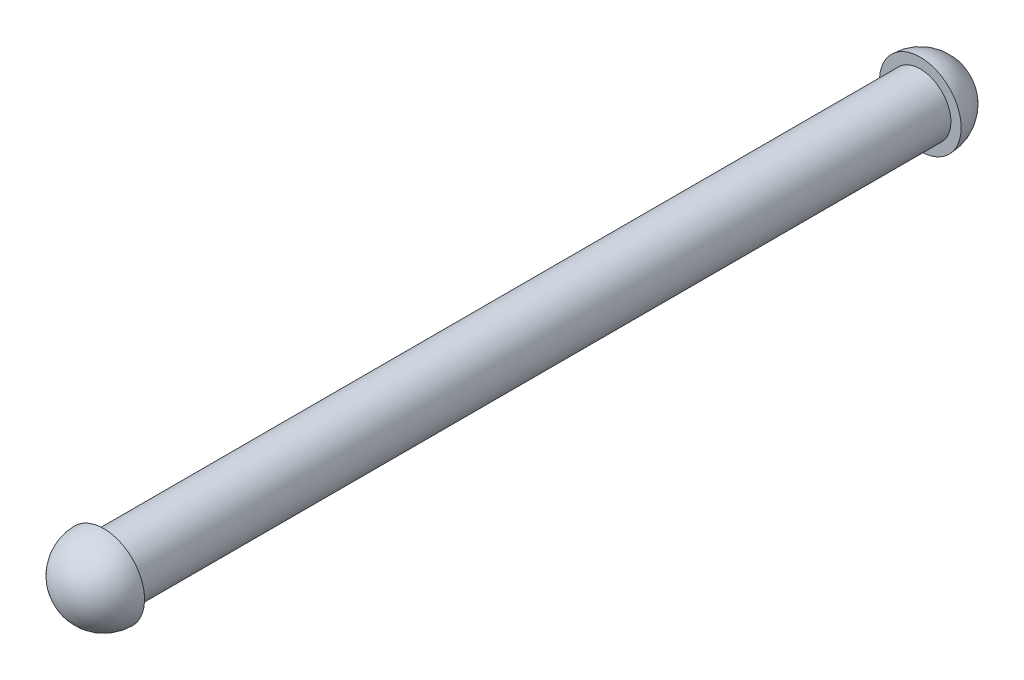
ISO-10303-21;
HEADER;
FILE_DESCRIPTION(('STEP AP214'),'2;1');
FILE_NAME('part.step','',(''),(''),'','','');
FILE_SCHEMA(('AUTOMOTIVE_DESIGN { 1 0 10303 214 1 1 1 1 }'));
ENDSEC;
DATA;
#1=APPLICATION_CONTEXT('core data for automotive mechanical design processes');
#2=APPLICATION_PROTOCOL_DEFINITION('international standard','automotive_design',2000,#1);
#3=PRODUCT_CONTEXT('',#1,'mechanical');
#4=PRODUCT('Part','Part','',(#3));
#5=PRODUCT_RELATED_PRODUCT_CATEGORY('part','',(#4));
#6=PRODUCT_DEFINITION_FORMATION('','',#4);
#7=PRODUCT_DEFINITION_CONTEXT('part definition',#1,'design');
#8=PRODUCT_DEFINITION('design','',#6,#7);
#9=PRODUCT_DEFINITION_SHAPE('','',#8);
#10=(LENGTH_UNIT() NAMED_UNIT(*) SI_UNIT(.MILLI.,.METRE.));
#11=(NAMED_UNIT(*) PLANE_ANGLE_UNIT() SI_UNIT($,.RADIAN.));
#12=(NAMED_UNIT(*) SI_UNIT($,.STERADIAN.) SOLID_ANGLE_UNIT());
#13=UNCERTAINTY_MEASURE_WITH_UNIT(LENGTH_MEASURE(1.E-05),#10,'distance_accuracy_value','');
#14=(GEOMETRIC_REPRESENTATION_CONTEXT(3) GLOBAL_UNCERTAINTY_ASSIGNED_CONTEXT((#13)) GLOBAL_UNIT_ASSIGNED_CONTEXT((#10,
#11,#12)) REPRESENTATION_CONTEXT('',''));
#15=CARTESIAN_POINT('',(0.,0.,0.));
#16=DIRECTION('',(0.,0.,1.));
#17=DIRECTION('',(1.,0.,0.));
#18=AXIS2_PLACEMENT_3D('',#15,#16,#17);
#19=CARTESIAN_POINT('',(0.,0.,0.));
#20=DIRECTION('',(-1.,0.,0.));
#21=DIRECTION('',(0.,-1.,0.));
#22=AXIS2_PLACEMENT_3D('',#19,#20,#21);
#23=SPHERICAL_SURFACE('',#22,0.5);
#24=CARTESIAN_POINT('',(0.,0.,0.));
#25=DIRECTION('',(0.,0.,-1.));
#26=DIRECTION('',(1.,0.,0.));
#27=AXIS2_PLACEMENT_3D('',#24,#25,#26);
#28=SPHERICAL_SURFACE('',#27,0.5);
#29=CARTESIAN_POINT('',(0.,0.,0.));
#30=DIRECTION('',(0.,0.,-1.));
#31=DIRECTION('',(1.,0.,0.));
#32=AXIS2_PLACEMENT_3D('',#29,#30,#31);
#33=CIRCLE('',#32,0.5);
#34=CARTESIAN_POINT('',(0.5,0.,0.));
#35=VERTEX_POINT('',#34);
#36=EDGE_CURVE('E39',#35,#35,#33,.T.);
#37=ORIENTED_EDGE('',*,*,#36,.T.);
#38=EDGE_LOOP('',(#37));
#39=FACE_BOUND('',#38,.T.);
#40=ADVANCED_FACE('F33',(#39),#28,.T.);
#41=CARTESIAN_POINT('',(0.,0.,0.));
#42=DIRECTION('',(0.,0.,-1.));
#43=DIRECTION('',(1.,0.,0.));
#44=AXIS2_PLACEMENT_3D('',#41,#42,#43);
#45=PLANE('',#44);
#46=CARTESIAN_POINT('',(0.,0.,0.));
#47=DIRECTION('',(0.,0.,-1.));
#48=DIRECTION('',(0.,1.,0.));
#49=AXIS2_PLACEMENT_3D('',#46,#47,#48);
#50=CIRCLE('',#49,0.375);
#51=CARTESIAN_POINT('',(0.,0.375,0.));
#52=VERTEX_POINT('',#51);
#53=EDGE_CURVE('E10',#52,#52,#50,.F.);
#54=ORIENTED_EDGE('',*,*,#53,.F.);
#55=EDGE_LOOP('',(#54));
#56=FACE_BOUND('',#55,.T.);
#57=ORIENTED_EDGE('',*,*,#36,.F.);
#58=EDGE_LOOP('',(#57));
#59=FACE_BOUND('',#58,.T.);
#60=ADVANCED_FACE('F65',(#56,#59),#45,.F.);
#61=CARTESIAN_POINT('',(0.,0.,10.));
#62=DIRECTION('',(0.,0.,-1.));
#63=DIRECTION('',(-1.,0.,0.));
#64=AXIS2_PLACEMENT_3D('',#61,#62,#63);
#65=CYLINDRICAL_SURFACE('',#64,0.375);
#66=CARTESIAN_POINT('',(0.,0.,10.));
#67=DIRECTION('',(0.,0.,1.));
#68=DIRECTION('',(1.,0.,0.));
#69=AXIS2_PLACEMENT_3D('',#66,#67,#68);
#70=CIRCLE('',#69,0.375);
#71=CARTESIAN_POINT('',(0.375,0.,10.));
#72=VERTEX_POINT('',#71);
#73=EDGE_CURVE('E43',#72,#72,#70,.T.);
#74=ORIENTED_EDGE('',*,*,#73,.F.);
#75=EDGE_LOOP('',(#74));
#76=FACE_BOUND('',#75,.T.);
#77=ORIENTED_EDGE('',*,*,#53,.T.);
#78=EDGE_LOOP('',(#77));
#79=FACE_BOUND('',#78,.T.);
#80=ADVANCED_FACE('F57',(#76,#79),#65,.T.);
#81=CARTESIAN_POINT('',(0.,0.,10.));
#82=DIRECTION('',(0.,-1.,0.));
#83=DIRECTION('',(1.,0.,0.));
#84=AXIS2_PLACEMENT_3D('',#81,#82,#83);
#85=SPHERICAL_SURFACE('',#84,0.5);
#86=CARTESIAN_POINT('',(0.,0.,10.));
#87=DIRECTION('',(0.,0.,-1.));
#88=DIRECTION('',(-1.,0.,0.));
#89=AXIS2_PLACEMENT_3D('',#86,#87,#88);
#90=SPHERICAL_SURFACE('',#89,0.5);
#91=CARTESIAN_POINT('',(0.,0.,10.));
#92=DIRECTION('',(0.,0.,-1.));
#93=DIRECTION('',(-1.,0.,0.));
#94=AXIS2_PLACEMENT_3D('',#91,#92,#93);
#95=CIRCLE('',#94,0.5);
#96=CARTESIAN_POINT('',(-0.5,0.,10.));
#97=VERTEX_POINT('',#96);
#98=EDGE_CURVE('E47',#97,#97,#95,.T.);
#99=ORIENTED_EDGE('',*,*,#98,.F.);
#100=EDGE_LOOP('',(#99));
#101=FACE_BOUND('',#100,.T.);
#102=ADVANCED_FACE('F55',(#101),#90,.T.);
#103=CARTESIAN_POINT('',(0.,0.,10.));
#104=DIRECTION('',(0.,0.,-1.));
#105=DIRECTION('',(-1.,0.,0.));
#106=AXIS2_PLACEMENT_3D('',#103,#104,#105);
#107=PLANE('',#106);
#108=ORIENTED_EDGE('',*,*,#73,.T.);
#109=EDGE_LOOP('',(#108));
#110=FACE_BOUND('',#109,.T.);
#111=ORIENTED_EDGE('',*,*,#98,.T.);
#112=EDGE_LOOP('',(#111));
#113=FACE_BOUND('',#112,.T.);
#114=ADVANCED_FACE('F53',(#110,#113),#107,.T.);
#115=CLOSED_SHELL('',(#40,#60,#80,#102,#114));
#116=MANIFOLD_SOLID_BREP('B2',#115);
#117=ADVANCED_BREP_SHAPE_REPRESENTATION('',(#18,#116),#14);
#118=SHAPE_DEFINITION_REPRESENTATION(#9,#117);
ENDSEC;
END-ISO-10303-21;
